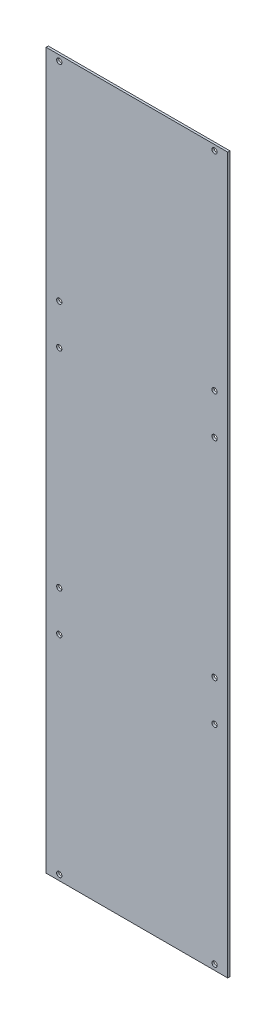
ISO-10303-21;
HEADER;
FILE_DESCRIPTION(('STEP AP214'),'2;1');
FILE_NAME('part.step','',(''),(''),'','','');
FILE_SCHEMA(('AUTOMOTIVE_DESIGN { 1 0 10303 214 1 1 1 1 }'));
ENDSEC;
DATA;
#1=APPLICATION_CONTEXT('core data for automotive mechanical design processes');
#2=APPLICATION_PROTOCOL_DEFINITION('international standard','automotive_design',2000,#1);
#3=PRODUCT_CONTEXT('',#1,'mechanical');
#4=PRODUCT('Part','Part','',(#3));
#5=PRODUCT_RELATED_PRODUCT_CATEGORY('part','',(#4));
#6=PRODUCT_DEFINITION_FORMATION('','',#4);
#7=PRODUCT_DEFINITION_CONTEXT('part definition',#1,'design');
#8=PRODUCT_DEFINITION('design','',#6,#7);
#9=PRODUCT_DEFINITION_SHAPE('','',#8);
#10=(LENGTH_UNIT() NAMED_UNIT(*) SI_UNIT(.MILLI.,.METRE.));
#11=(NAMED_UNIT(*) PLANE_ANGLE_UNIT() SI_UNIT($,.RADIAN.));
#12=(NAMED_UNIT(*) SI_UNIT($,.STERADIAN.) SOLID_ANGLE_UNIT());
#13=UNCERTAINTY_MEASURE_WITH_UNIT(LENGTH_MEASURE(1.E-05),#10,'distance_accuracy_value','');
#14=(GEOMETRIC_REPRESENTATION_CONTEXT(3) GLOBAL_UNCERTAINTY_ASSIGNED_CONTEXT((#13)) GLOBAL_UNIT_ASSIGNED_CONTEXT((#10,
#11,#12)) REPRESENTATION_CONTEXT('',''));
#15=CARTESIAN_POINT('',(0.,0.,0.));
#16=DIRECTION('',(0.,0.,1.));
#17=DIRECTION('',(1.,0.,0.));
#18=AXIS2_PLACEMENT_3D('',#15,#16,#17);
#19=CARTESIAN_POINT('',(41.5,-163.5,0.5));
#20=DIRECTION('',(-1.,0.,0.));
#21=DIRECTION('',(0.,0.,1.));
#22=AXIS2_PLACEMENT_3D('',#19,#20,#21);
#23=PLANE('',#22);
#24=DIRECTION('',(0.,1.,0.));
#25=VECTOR('',#24,1.);
#26=CARTESIAN_POINT('',(41.5,-163.5,-0.5));
#27=LINE('',#26,#25);
#28=CARTESIAN_POINT('',(41.5,-163.5,-0.5));
#29=VERTEX_POINT('',#28);
#30=CARTESIAN_POINT('',(41.5,163.5,-0.5));
#31=VERTEX_POINT('',#30);
#32=EDGE_CURVE('E97',#29,#31,#27,.T.);
#33=ORIENTED_EDGE('',*,*,#32,.T.);
#34=DIRECTION('',(0.,0.,-1.));
#35=VECTOR('',#34,1.);
#36=CARTESIAN_POINT('',(41.5,163.5,0.5));
#37=LINE('',#36,#35);
#38=CARTESIAN_POINT('',(41.5,163.5,0.5));
#39=VERTEX_POINT('',#38);
#40=EDGE_CURVE('E11',#39,#31,#37,.T.);
#41=ORIENTED_EDGE('',*,*,#40,.F.);
#42=DIRECTION('',(0.,1.,0.));
#43=VECTOR('',#42,1.);
#44=CARTESIAN_POINT('',(41.5,-163.5,0.5));
#45=LINE('',#44,#43);
#46=CARTESIAN_POINT('',(41.5,-163.5,0.5));
#47=VERTEX_POINT('',#46);
#48=EDGE_CURVE('E85',#47,#39,#45,.T.);
#49=ORIENTED_EDGE('',*,*,#48,.F.);
#50=DIRECTION('',(0.,0.,-1.));
#51=VECTOR('',#50,1.);
#52=CARTESIAN_POINT('',(41.5,-163.5,0.5));
#53=LINE('',#52,#51);
#54=EDGE_CURVE('E93',#47,#29,#53,.T.);
#55=ORIENTED_EDGE('',*,*,#54,.T.);
#56=EDGE_LOOP('',(#33,#41,#49,#55));
#57=FACE_BOUND('',#56,.T.);
#58=ADVANCED_FACE('F34',(#57),#23,.F.);
#59=CARTESIAN_POINT('',(-41.5,163.5,0.5));
#60=DIRECTION('',(0.,-1.,0.));
#61=DIRECTION('',(0.,0.,-1.));
#62=AXIS2_PLACEMENT_3D('',#59,#60,#61);
#63=PLANE('',#62);
#64=DIRECTION('',(-1.,0.,0.));
#65=VECTOR('',#64,1.);
#66=CARTESIAN_POINT('',(-41.5,163.5,-0.5));
#67=LINE('',#66,#65);
#68=CARTESIAN_POINT('',(-41.5,163.5,-0.5));
#69=VERTEX_POINT('',#68);
#70=EDGE_CURVE('E89',#31,#69,#67,.T.);
#71=ORIENTED_EDGE('',*,*,#70,.T.);
#72=DIRECTION('',(0.,0.,-1.));
#73=VECTOR('',#72,1.);
#74=CARTESIAN_POINT('',(-41.5,163.5,0.5));
#75=LINE('',#74,#73);
#76=CARTESIAN_POINT('',(-41.5,163.5,0.5));
#77=VERTEX_POINT('',#76);
#78=EDGE_CURVE('E42',#77,#69,#75,.T.);
#79=ORIENTED_EDGE('',*,*,#78,.F.);
#80=DIRECTION('',(-1.,0.,0.));
#81=VECTOR('',#80,1.);
#82=CARTESIAN_POINT('',(-41.5,163.5,0.5));
#83=LINE('',#82,#81);
#84=EDGE_CURVE('E80',#39,#77,#83,.T.);
#85=ORIENTED_EDGE('',*,*,#84,.F.);
#86=ORIENTED_EDGE('',*,*,#40,.T.);
#87=EDGE_LOOP('',(#71,#79,#85,#86));
#88=FACE_BOUND('',#87,.T.);
#89=ADVANCED_FACE('F88',(#88),#63,.F.);
#90=CARTESIAN_POINT('',(-41.5,-163.5,0.5));
#91=DIRECTION('',(1.,0.,0.));
#92=DIRECTION('',(0.,0.,-1.));
#93=AXIS2_PLACEMENT_3D('',#90,#91,#92);
#94=PLANE('',#93);
#95=DIRECTION('',(0.,-1.,0.));
#96=VECTOR('',#95,1.);
#97=CARTESIAN_POINT('',(-41.5,-163.5,-0.5));
#98=LINE('',#97,#96);
#99=CARTESIAN_POINT('',(-41.5,-163.5,-0.5));
#100=VERTEX_POINT('',#99);
#101=EDGE_CURVE('E67',#69,#100,#98,.T.);
#102=ORIENTED_EDGE('',*,*,#101,.T.);
#103=DIRECTION('',(0.,0.,-1.));
#104=VECTOR('',#103,1.);
#105=CARTESIAN_POINT('',(-41.5,-163.5,0.5));
#106=LINE('',#105,#104);
#107=CARTESIAN_POINT('',(-41.5,-163.5,0.5));
#108=VERTEX_POINT('',#107);
#109=EDGE_CURVE('E90',#108,#100,#106,.T.);
#110=ORIENTED_EDGE('',*,*,#109,.F.);
#111=DIRECTION('',(0.,-1.,0.));
#112=VECTOR('',#111,1.);
#113=CARTESIAN_POINT('',(-41.5,-163.5,0.5));
#114=LINE('',#113,#112);
#115=EDGE_CURVE('E83',#77,#108,#114,.T.);
#116=ORIENTED_EDGE('',*,*,#115,.F.);
#117=ORIENTED_EDGE('',*,*,#78,.T.);
#118=EDGE_LOOP('',(#102,#110,#116,#117));
#119=FACE_BOUND('',#118,.T.);
#120=ADVANCED_FACE('F91',(#119),#94,.F.);
#121=CARTESIAN_POINT('',(-41.5,-163.5,0.5));
#122=DIRECTION('',(0.,1.,0.));
#123=DIRECTION('',(0.,0.,1.));
#124=AXIS2_PLACEMENT_3D('',#121,#122,#123);
#125=PLANE('',#124);
#126=DIRECTION('',(1.,0.,0.));
#127=VECTOR('',#126,1.);
#128=CARTESIAN_POINT('',(-41.5,-163.5,-0.5));
#129=LINE('',#128,#127);
#130=EDGE_CURVE('E73',#100,#29,#129,.T.);
#131=ORIENTED_EDGE('',*,*,#130,.T.);
#132=ORIENTED_EDGE('',*,*,#54,.F.);
#133=DIRECTION('',(1.,0.,0.));
#134=VECTOR('',#133,1.);
#135=CARTESIAN_POINT('',(-41.5,-163.5,0.5));
#136=LINE('',#135,#134);
#137=EDGE_CURVE('E50',#108,#47,#136,.T.);
#138=ORIENTED_EDGE('',*,*,#137,.F.);
#139=ORIENTED_EDGE('',*,*,#109,.T.);
#140=EDGE_LOOP('',(#131,#132,#138,#139));
#141=FACE_BOUND('',#140,.T.);
#142=ADVANCED_FACE('F105',(#141),#125,.F.);
#143=CARTESIAN_POINT('',(0.,0.,0.5));
#144=DIRECTION('',(0.,0.,-1.));
#145=DIRECTION('',(-1.,0.,0.));
#146=AXIS2_PLACEMENT_3D('',#143,#144,#145);
#147=PLANE('',#146);
#148=CARTESIAN_POINT('',(-35.5,161.,0.5));
#149=DIRECTION('',(0.,0.,1.));
#150=DIRECTION('',(1.,0.,0.));
#151=AXIS2_PLACEMENT_3D('',#148,#149,#150);
#152=CIRCLE('',#151,1.2);
#153=CARTESIAN_POINT('',(-34.3,161.,0.5));
#154=VERTEX_POINT('',#153);
#155=EDGE_CURVE('E179',#154,#154,#152,.T.);
#156=ORIENTED_EDGE('',*,*,#155,.F.);
#157=EDGE_LOOP('',(#156));
#158=FACE_BOUND('',#157,.T.);
#159=CARTESIAN_POINT('',(35.5,161.,0.5));
#160=DIRECTION('',(0.,0.,1.));
#161=DIRECTION('',(1.,0.,0.));
#162=AXIS2_PLACEMENT_3D('',#159,#160,#161);
#163=CIRCLE('',#162,1.2);
#164=CARTESIAN_POINT('',(36.7,161.,0.5));
#165=VERTEX_POINT('',#164);
#166=EDGE_CURVE('E173',#165,#165,#163,.T.);
#167=ORIENTED_EDGE('',*,*,#166,.F.);
#168=EDGE_LOOP('',(#167));
#169=FACE_BOUND('',#168,.T.);
#170=CARTESIAN_POINT('',(-35.5,66.,0.5));
#171=DIRECTION('',(0.,0.,1.));
#172=DIRECTION('',(1.,0.,0.));
#173=AXIS2_PLACEMENT_3D('',#170,#171,#172);
#174=CIRCLE('',#173,1.2);
#175=CARTESIAN_POINT('',(-34.3,66.,0.5));
#176=VERTEX_POINT('',#175);
#177=EDGE_CURVE('E167',#176,#176,#174,.T.);
#178=ORIENTED_EDGE('',*,*,#177,.F.);
#179=EDGE_LOOP('',(#178));
#180=FACE_BOUND('',#179,.T.);
#181=CARTESIAN_POINT('',(35.5,66.,0.5));
#182=DIRECTION('',(0.,0.,1.));
#183=DIRECTION('',(1.,0.,0.));
#184=AXIS2_PLACEMENT_3D('',#181,#182,#183);
#185=CIRCLE('',#184,1.2);
#186=CARTESIAN_POINT('',(36.7,66.,0.5));
#187=VERTEX_POINT('',#186);
#188=EDGE_CURVE('E161',#187,#187,#185,.T.);
#189=ORIENTED_EDGE('',*,*,#188,.F.);
#190=EDGE_LOOP('',(#189));
#191=FACE_BOUND('',#190,.T.);
#192=CARTESIAN_POINT('',(-35.5,47.5,0.5));
#193=DIRECTION('',(0.,0.,1.));
#194=DIRECTION('',(1.,0.,0.));
#195=AXIS2_PLACEMENT_3D('',#192,#193,#194);
#196=CIRCLE('',#195,1.2);
#197=CARTESIAN_POINT('',(-34.3,47.5,0.5));
#198=VERTEX_POINT('',#197);
#199=EDGE_CURVE('E155',#198,#198,#196,.T.);
#200=ORIENTED_EDGE('',*,*,#199,.F.);
#201=EDGE_LOOP('',(#200));
#202=FACE_BOUND('',#201,.T.);
#203=CARTESIAN_POINT('',(35.5,47.5,0.5));
#204=DIRECTION('',(0.,0.,1.));
#205=DIRECTION('',(1.,0.,0.));
#206=AXIS2_PLACEMENT_3D('',#203,#204,#205);
#207=CIRCLE('',#206,1.2);
#208=CARTESIAN_POINT('',(36.7,47.5,0.5));
#209=VERTEX_POINT('',#208);
#210=EDGE_CURVE('E149',#209,#209,#207,.T.);
#211=ORIENTED_EDGE('',*,*,#210,.F.);
#212=EDGE_LOOP('',(#211));
#213=FACE_BOUND('',#212,.T.);
#214=CARTESIAN_POINT('',(-35.5,-47.5,0.5));
#215=DIRECTION('',(0.,0.,1.));
#216=DIRECTION('',(1.,0.,0.));
#217=AXIS2_PLACEMENT_3D('',#214,#215,#216);
#218=CIRCLE('',#217,1.2);
#219=CARTESIAN_POINT('',(-34.3,-47.5,0.5));
#220=VERTEX_POINT('',#219);
#221=EDGE_CURVE('E143',#220,#220,#218,.T.);
#222=ORIENTED_EDGE('',*,*,#221,.F.);
#223=EDGE_LOOP('',(#222));
#224=FACE_BOUND('',#223,.T.);
#225=CARTESIAN_POINT('',(35.5,-47.5,0.5));
#226=DIRECTION('',(0.,0.,1.));
#227=DIRECTION('',(1.,0.,0.));
#228=AXIS2_PLACEMENT_3D('',#225,#226,#227);
#229=CIRCLE('',#228,1.2);
#230=CARTESIAN_POINT('',(36.7,-47.5,0.5));
#231=VERTEX_POINT('',#230);
#232=EDGE_CURVE('E137',#231,#231,#229,.T.);
#233=ORIENTED_EDGE('',*,*,#232,.F.);
#234=EDGE_LOOP('',(#233));
#235=FACE_BOUND('',#234,.T.);
#236=CARTESIAN_POINT('',(-35.5,-66.,0.5));
#237=DIRECTION('',(0.,0.,1.));
#238=DIRECTION('',(1.,0.,0.));
#239=AXIS2_PLACEMENT_3D('',#236,#237,#238);
#240=CIRCLE('',#239,1.2);
#241=CARTESIAN_POINT('',(-34.3,-66.,0.5));
#242=VERTEX_POINT('',#241);
#243=EDGE_CURVE('E131',#242,#242,#240,.T.);
#244=ORIENTED_EDGE('',*,*,#243,.F.);
#245=EDGE_LOOP('',(#244));
#246=FACE_BOUND('',#245,.T.);
#247=CARTESIAN_POINT('',(35.5,-66.,0.5));
#248=DIRECTION('',(0.,0.,1.));
#249=DIRECTION('',(1.,0.,0.));
#250=AXIS2_PLACEMENT_3D('',#247,#248,#249);
#251=CIRCLE('',#250,1.2);
#252=CARTESIAN_POINT('',(36.7,-66.,0.5));
#253=VERTEX_POINT('',#252);
#254=EDGE_CURVE('E125',#253,#253,#251,.T.);
#255=ORIENTED_EDGE('',*,*,#254,.F.);
#256=EDGE_LOOP('',(#255));
#257=FACE_BOUND('',#256,.T.);
#258=CARTESIAN_POINT('',(-35.5,-161.,0.5));
#259=DIRECTION('',(0.,0.,1.));
#260=DIRECTION('',(1.,0.,0.));
#261=AXIS2_PLACEMENT_3D('',#258,#259,#260);
#262=CIRCLE('',#261,1.2);
#263=CARTESIAN_POINT('',(-34.3,-161.,0.5));
#264=VERTEX_POINT('',#263);
#265=EDGE_CURVE('E119',#264,#264,#262,.T.);
#266=ORIENTED_EDGE('',*,*,#265,.F.);
#267=EDGE_LOOP('',(#266));
#268=FACE_BOUND('',#267,.T.);
#269=CARTESIAN_POINT('',(35.5,-161.,0.5));
#270=DIRECTION('',(0.,0.,1.));
#271=DIRECTION('',(1.,0.,0.));
#272=AXIS2_PLACEMENT_3D('',#269,#270,#271);
#273=CIRCLE('',#272,1.2);
#274=CARTESIAN_POINT('',(36.7,-161.,0.5));
#275=VERTEX_POINT('',#274);
#276=EDGE_CURVE('E113',#275,#275,#273,.T.);
#277=ORIENTED_EDGE('',*,*,#276,.F.);
#278=EDGE_LOOP('',(#277));
#279=FACE_BOUND('',#278,.T.);
#280=ORIENTED_EDGE('',*,*,#48,.T.);
#281=ORIENTED_EDGE('',*,*,#84,.T.);
#282=ORIENTED_EDGE('',*,*,#115,.T.);
#283=ORIENTED_EDGE('',*,*,#137,.T.);
#284=EDGE_LOOP('',(#280,#281,#282,#283));
#285=FACE_BOUND('',#284,.T.);
#286=ADVANCED_FACE('F81',(#158,#169,#180,#191,#202,#213,#224,#235,#246,#257,#268,#279,#285),
#147,.F.);
#287=CARTESIAN_POINT('',(0.,0.,-0.5));
#288=DIRECTION('',(0.,0.,-1.));
#289=DIRECTION('',(-1.,0.,0.));
#290=AXIS2_PLACEMENT_3D('',#287,#288,#289);
#291=PLANE('',#290);
#292=CARTESIAN_POINT('',(-35.5,161.,-0.5));
#293=DIRECTION('',(0.,0.,1.));
#294=DIRECTION('',(1.,0.,0.));
#295=AXIS2_PLACEMENT_3D('',#292,#293,#294);
#296=CIRCLE('',#295,1.2);
#297=CARTESIAN_POINT('',(-34.3,161.,-0.5));
#298=VERTEX_POINT('',#297);
#299=EDGE_CURVE('E176',#298,#298,#296,.T.);
#300=ORIENTED_EDGE('',*,*,#299,.T.);
#301=EDGE_LOOP('',(#300));
#302=FACE_BOUND('',#301,.T.);
#303=CARTESIAN_POINT('',(35.5,161.,-0.5));
#304=DIRECTION('',(0.,0.,1.));
#305=DIRECTION('',(1.,0.,0.));
#306=AXIS2_PLACEMENT_3D('',#303,#304,#305);
#307=CIRCLE('',#306,1.2);
#308=CARTESIAN_POINT('',(36.7,161.,-0.5));
#309=VERTEX_POINT('',#308);
#310=EDGE_CURVE('E170',#309,#309,#307,.T.);
#311=ORIENTED_EDGE('',*,*,#310,.T.);
#312=EDGE_LOOP('',(#311));
#313=FACE_BOUND('',#312,.T.);
#314=CARTESIAN_POINT('',(-35.5,66.,-0.5));
#315=DIRECTION('',(0.,0.,1.));
#316=DIRECTION('',(1.,0.,0.));
#317=AXIS2_PLACEMENT_3D('',#314,#315,#316);
#318=CIRCLE('',#317,1.2);
#319=CARTESIAN_POINT('',(-34.3,66.,-0.5));
#320=VERTEX_POINT('',#319);
#321=EDGE_CURVE('E164',#320,#320,#318,.T.);
#322=ORIENTED_EDGE('',*,*,#321,.T.);
#323=EDGE_LOOP('',(#322));
#324=FACE_BOUND('',#323,.T.);
#325=CARTESIAN_POINT('',(35.5,66.,-0.5));
#326=DIRECTION('',(0.,0.,1.));
#327=DIRECTION('',(1.,0.,0.));
#328=AXIS2_PLACEMENT_3D('',#325,#326,#327);
#329=CIRCLE('',#328,1.2);
#330=CARTESIAN_POINT('',(36.7,66.,-0.5));
#331=VERTEX_POINT('',#330);
#332=EDGE_CURVE('E158',#331,#331,#329,.T.);
#333=ORIENTED_EDGE('',*,*,#332,.T.);
#334=EDGE_LOOP('',(#333));
#335=FACE_BOUND('',#334,.T.);
#336=CARTESIAN_POINT('',(-35.5,47.5,-0.5));
#337=DIRECTION('',(0.,0.,1.));
#338=DIRECTION('',(1.,0.,0.));
#339=AXIS2_PLACEMENT_3D('',#336,#337,#338);
#340=CIRCLE('',#339,1.2);
#341=CARTESIAN_POINT('',(-34.3,47.5,-0.5));
#342=VERTEX_POINT('',#341);
#343=EDGE_CURVE('E152',#342,#342,#340,.T.);
#344=ORIENTED_EDGE('',*,*,#343,.T.);
#345=EDGE_LOOP('',(#344));
#346=FACE_BOUND('',#345,.T.);
#347=CARTESIAN_POINT('',(35.5,47.5,-0.5));
#348=DIRECTION('',(0.,0.,1.));
#349=DIRECTION('',(1.,0.,0.));
#350=AXIS2_PLACEMENT_3D('',#347,#348,#349);
#351=CIRCLE('',#350,1.2);
#352=CARTESIAN_POINT('',(36.7,47.5,-0.5));
#353=VERTEX_POINT('',#352);
#354=EDGE_CURVE('E146',#353,#353,#351,.T.);
#355=ORIENTED_EDGE('',*,*,#354,.T.);
#356=EDGE_LOOP('',(#355));
#357=FACE_BOUND('',#356,.T.);
#358=CARTESIAN_POINT('',(-35.5,-47.5,-0.5));
#359=DIRECTION('',(0.,0.,1.));
#360=DIRECTION('',(1.,0.,0.));
#361=AXIS2_PLACEMENT_3D('',#358,#359,#360);
#362=CIRCLE('',#361,1.2);
#363=CARTESIAN_POINT('',(-34.3,-47.5,-0.5));
#364=VERTEX_POINT('',#363);
#365=EDGE_CURVE('E140',#364,#364,#362,.T.);
#366=ORIENTED_EDGE('',*,*,#365,.T.);
#367=EDGE_LOOP('',(#366));
#368=FACE_BOUND('',#367,.T.);
#369=CARTESIAN_POINT('',(35.5,-47.5,-0.5));
#370=DIRECTION('',(0.,0.,1.));
#371=DIRECTION('',(1.,0.,0.));
#372=AXIS2_PLACEMENT_3D('',#369,#370,#371);
#373=CIRCLE('',#372,1.2);
#374=CARTESIAN_POINT('',(36.7,-47.5,-0.5));
#375=VERTEX_POINT('',#374);
#376=EDGE_CURVE('E134',#375,#375,#373,.T.);
#377=ORIENTED_EDGE('',*,*,#376,.T.);
#378=EDGE_LOOP('',(#377));
#379=FACE_BOUND('',#378,.T.);
#380=CARTESIAN_POINT('',(-35.5,-66.,-0.5));
#381=DIRECTION('',(0.,0.,1.));
#382=DIRECTION('',(1.,0.,0.));
#383=AXIS2_PLACEMENT_3D('',#380,#381,#382);
#384=CIRCLE('',#383,1.2);
#385=CARTESIAN_POINT('',(-34.3,-66.,-0.5));
#386=VERTEX_POINT('',#385);
#387=EDGE_CURVE('E128',#386,#386,#384,.T.);
#388=ORIENTED_EDGE('',*,*,#387,.T.);
#389=EDGE_LOOP('',(#388));
#390=FACE_BOUND('',#389,.T.);
#391=CARTESIAN_POINT('',(35.5,-66.,-0.5));
#392=DIRECTION('',(0.,0.,1.));
#393=DIRECTION('',(1.,0.,0.));
#394=AXIS2_PLACEMENT_3D('',#391,#392,#393);
#395=CIRCLE('',#394,1.2);
#396=CARTESIAN_POINT('',(36.7,-66.,-0.5));
#397=VERTEX_POINT('',#396);
#398=EDGE_CURVE('E122',#397,#397,#395,.T.);
#399=ORIENTED_EDGE('',*,*,#398,.T.);
#400=EDGE_LOOP('',(#399));
#401=FACE_BOUND('',#400,.T.);
#402=CARTESIAN_POINT('',(-35.5,-161.,-0.5));
#403=DIRECTION('',(0.,0.,1.));
#404=DIRECTION('',(1.,0.,0.));
#405=AXIS2_PLACEMENT_3D('',#402,#403,#404);
#406=CIRCLE('',#405,1.2);
#407=CARTESIAN_POINT('',(-34.3,-161.,-0.5));
#408=VERTEX_POINT('',#407);
#409=EDGE_CURVE('E116',#408,#408,#406,.T.);
#410=ORIENTED_EDGE('',*,*,#409,.T.);
#411=EDGE_LOOP('',(#410));
#412=FACE_BOUND('',#411,.T.);
#413=CARTESIAN_POINT('',(35.5,-161.,-0.5));
#414=DIRECTION('',(0.,0.,1.));
#415=DIRECTION('',(1.,0.,0.));
#416=AXIS2_PLACEMENT_3D('',#413,#414,#415);
#417=CIRCLE('',#416,1.2);
#418=CARTESIAN_POINT('',(36.7,-161.,-0.5));
#419=VERTEX_POINT('',#418);
#420=EDGE_CURVE('E100',#419,#419,#417,.T.);
#421=ORIENTED_EDGE('',*,*,#420,.T.);
#422=EDGE_LOOP('',(#421));
#423=FACE_BOUND('',#422,.T.);
#424=ORIENTED_EDGE('',*,*,#32,.F.);
#425=ORIENTED_EDGE('',*,*,#130,.F.);
#426=ORIENTED_EDGE('',*,*,#101,.F.);
#427=ORIENTED_EDGE('',*,*,#70,.F.);
#428=EDGE_LOOP('',(#424,#425,#426,#427));
#429=FACE_BOUND('',#428,.T.);
#430=ADVANCED_FACE('F108',(#302,#313,#324,#335,#346,#357,#368,#379,#390,#401,#412,#423,#429),
#291,.T.);
#431=CARTESIAN_POINT('',(35.5,-161.,0.5));
#432=DIRECTION('',(0.,0.,1.));
#433=DIRECTION('',(1.,0.,0.));
#434=AXIS2_PLACEMENT_3D('',#431,#432,#433);
#435=CYLINDRICAL_SURFACE('',#434,1.2);
#436=ORIENTED_EDGE('',*,*,#420,.F.);
#437=EDGE_LOOP('',(#436));
#438=FACE_BOUND('',#437,.T.);
#439=ORIENTED_EDGE('',*,*,#276,.T.);
#440=EDGE_LOOP('',(#439));
#441=FACE_BOUND('',#440,.T.);
#442=ADVANCED_FACE('F210',(#438,#441),#435,.F.);
#443=CARTESIAN_POINT('',(-35.5,-161.,0.5));
#444=DIRECTION('',(0.,0.,1.));
#445=DIRECTION('',(1.,0.,0.));
#446=AXIS2_PLACEMENT_3D('',#443,#444,#445);
#447=CYLINDRICAL_SURFACE('',#446,1.2);
#448=ORIENTED_EDGE('',*,*,#409,.F.);
#449=EDGE_LOOP('',(#448));
#450=FACE_BOUND('',#449,.T.);
#451=ORIENTED_EDGE('',*,*,#265,.T.);
#452=EDGE_LOOP('',(#451));
#453=FACE_BOUND('',#452,.T.);
#454=ADVANCED_FACE('F212',(#450,#453),#447,.F.);
#455=CARTESIAN_POINT('',(35.5,-66.,0.5));
#456=DIRECTION('',(0.,0.,1.));
#457=DIRECTION('',(1.,0.,0.));
#458=AXIS2_PLACEMENT_3D('',#455,#456,#457);
#459=CYLINDRICAL_SURFACE('',#458,1.2);
#460=ORIENTED_EDGE('',*,*,#398,.F.);
#461=EDGE_LOOP('',(#460));
#462=FACE_BOUND('',#461,.T.);
#463=ORIENTED_EDGE('',*,*,#254,.T.);
#464=EDGE_LOOP('',(#463));
#465=FACE_BOUND('',#464,.T.);
#466=ADVANCED_FACE('F219',(#462,#465),#459,.F.);
#467=CARTESIAN_POINT('',(-35.5,-66.,0.5));
#468=DIRECTION('',(0.,0.,1.));
#469=DIRECTION('',(1.,0.,0.));
#470=AXIS2_PLACEMENT_3D('',#467,#468,#469);
#471=CYLINDRICAL_SURFACE('',#470,1.2);
#472=ORIENTED_EDGE('',*,*,#387,.F.);
#473=EDGE_LOOP('',(#472));
#474=FACE_BOUND('',#473,.T.);
#475=ORIENTED_EDGE('',*,*,#243,.T.);
#476=EDGE_LOOP('',(#475));
#477=FACE_BOUND('',#476,.T.);
#478=ADVANCED_FACE('F266',(#474,#477),#471,.F.);
#479=CARTESIAN_POINT('',(35.5,-47.5,0.5));
#480=DIRECTION('',(0.,0.,1.));
#481=DIRECTION('',(1.,0.,0.));
#482=AXIS2_PLACEMENT_3D('',#479,#480,#481);
#483=CYLINDRICAL_SURFACE('',#482,1.2);
#484=ORIENTED_EDGE('',*,*,#376,.F.);
#485=EDGE_LOOP('',(#484));
#486=FACE_BOUND('',#485,.T.);
#487=ORIENTED_EDGE('',*,*,#232,.T.);
#488=EDGE_LOOP('',(#487));
#489=FACE_BOUND('',#488,.T.);
#490=ADVANCED_FACE('F276',(#486,#489),#483,.F.);
#491=CARTESIAN_POINT('',(-35.5,-47.5,0.5));
#492=DIRECTION('',(0.,0.,1.));
#493=DIRECTION('',(1.,0.,0.));
#494=AXIS2_PLACEMENT_3D('',#491,#492,#493);
#495=CYLINDRICAL_SURFACE('',#494,1.2);
#496=ORIENTED_EDGE('',*,*,#365,.F.);
#497=EDGE_LOOP('',(#496));
#498=FACE_BOUND('',#497,.T.);
#499=ORIENTED_EDGE('',*,*,#221,.T.);
#500=EDGE_LOOP('',(#499));
#501=FACE_BOUND('',#500,.T.);
#502=ADVANCED_FACE('F286',(#498,#501),#495,.F.);
#503=CARTESIAN_POINT('',(35.5,47.5,0.5));
#504=DIRECTION('',(0.,0.,1.));
#505=DIRECTION('',(1.,0.,0.));
#506=AXIS2_PLACEMENT_3D('',#503,#504,#505);
#507=CYLINDRICAL_SURFACE('',#506,1.2);
#508=ORIENTED_EDGE('',*,*,#354,.F.);
#509=EDGE_LOOP('',(#508));
#510=FACE_BOUND('',#509,.T.);
#511=ORIENTED_EDGE('',*,*,#210,.T.);
#512=EDGE_LOOP('',(#511));
#513=FACE_BOUND('',#512,.T.);
#514=ADVANCED_FACE('F296',(#510,#513),#507,.F.);
#515=CARTESIAN_POINT('',(-35.5,47.5,0.5));
#516=DIRECTION('',(0.,0.,1.));
#517=DIRECTION('',(1.,0.,0.));
#518=AXIS2_PLACEMENT_3D('',#515,#516,#517);
#519=CYLINDRICAL_SURFACE('',#518,1.2);
#520=ORIENTED_EDGE('',*,*,#343,.F.);
#521=EDGE_LOOP('',(#520));
#522=FACE_BOUND('',#521,.T.);
#523=ORIENTED_EDGE('',*,*,#199,.T.);
#524=EDGE_LOOP('',(#523));
#525=FACE_BOUND('',#524,.T.);
#526=ADVANCED_FACE('F306',(#522,#525),#519,.F.);
#527=CARTESIAN_POINT('',(35.5,66.,0.5));
#528=DIRECTION('',(0.,0.,1.));
#529=DIRECTION('',(1.,0.,0.));
#530=AXIS2_PLACEMENT_3D('',#527,#528,#529);
#531=CYLINDRICAL_SURFACE('',#530,1.2);
#532=ORIENTED_EDGE('',*,*,#332,.F.);
#533=EDGE_LOOP('',(#532));
#534=FACE_BOUND('',#533,.T.);
#535=ORIENTED_EDGE('',*,*,#188,.T.);
#536=EDGE_LOOP('',(#535));
#537=FACE_BOUND('',#536,.T.);
#538=ADVANCED_FACE('F316',(#534,#537),#531,.F.);
#539=CARTESIAN_POINT('',(-35.5,66.,0.5));
#540=DIRECTION('',(0.,0.,1.));
#541=DIRECTION('',(1.,0.,0.));
#542=AXIS2_PLACEMENT_3D('',#539,#540,#541);
#543=CYLINDRICAL_SURFACE('',#542,1.2);
#544=ORIENTED_EDGE('',*,*,#321,.F.);
#545=EDGE_LOOP('',(#544));
#546=FACE_BOUND('',#545,.T.);
#547=ORIENTED_EDGE('',*,*,#177,.T.);
#548=EDGE_LOOP('',(#547));
#549=FACE_BOUND('',#548,.T.);
#550=ADVANCED_FACE('F326',(#546,#549),#543,.F.);
#551=CARTESIAN_POINT('',(35.5,161.,0.5));
#552=DIRECTION('',(0.,0.,1.));
#553=DIRECTION('',(1.,0.,0.));
#554=AXIS2_PLACEMENT_3D('',#551,#552,#553);
#555=CYLINDRICAL_SURFACE('',#554,1.2);
#556=ORIENTED_EDGE('',*,*,#310,.F.);
#557=EDGE_LOOP('',(#556));
#558=FACE_BOUND('',#557,.T.);
#559=ORIENTED_EDGE('',*,*,#166,.T.);
#560=EDGE_LOOP('',(#559));
#561=FACE_BOUND('',#560,.T.);
#562=ADVANCED_FACE('F336',(#558,#561),#555,.F.);
#563=CARTESIAN_POINT('',(-35.5,161.,0.5));
#564=DIRECTION('',(0.,0.,1.));
#565=DIRECTION('',(1.,0.,0.));
#566=AXIS2_PLACEMENT_3D('',#563,#564,#565);
#567=CYLINDRICAL_SURFACE('',#566,1.2);
#568=ORIENTED_EDGE('',*,*,#299,.F.);
#569=EDGE_LOOP('',(#568));
#570=FACE_BOUND('',#569,.T.);
#571=ORIENTED_EDGE('',*,*,#155,.T.);
#572=EDGE_LOOP('',(#571));
#573=FACE_BOUND('',#572,.T.);
#574=ADVANCED_FACE('F183',(#570,#573),#567,.F.);
#575=CLOSED_SHELL('',(#58,#89,#120,#142,#286,#430,#442,#454,#466,#478,#490,#502,#514,#526,#538,
#550,#562,#574));
#576=MANIFOLD_SOLID_BREP('B2',#575);
#577=ADVANCED_BREP_SHAPE_REPRESENTATION('',(#18,#576),#14);
#578=SHAPE_DEFINITION_REPRESENTATION(#9,#577);
ENDSEC;
END-ISO-10303-21;
